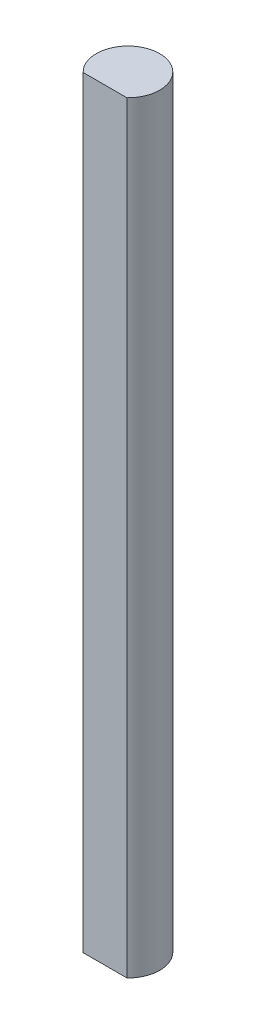
ISO-10303-21;
HEADER;
FILE_DESCRIPTION(('STEP AP214'),'2;1');
FILE_NAME('part.step','',(''),(''),'','','');
FILE_SCHEMA(('AUTOMOTIVE_DESIGN { 1 0 10303 214 1 1 1 1 }'));
ENDSEC;
DATA;
#1=APPLICATION_CONTEXT('core data for automotive mechanical design processes');
#2=APPLICATION_PROTOCOL_DEFINITION('international standard','automotive_design',2000,#1);
#3=PRODUCT_CONTEXT('',#1,'mechanical');
#4=PRODUCT('Part','Part','',(#3));
#5=PRODUCT_RELATED_PRODUCT_CATEGORY('part','',(#4));
#6=PRODUCT_DEFINITION_FORMATION('','',#4);
#7=PRODUCT_DEFINITION_CONTEXT('part definition',#1,'design');
#8=PRODUCT_DEFINITION('design','',#6,#7);
#9=PRODUCT_DEFINITION_SHAPE('','',#8);
#10=(LENGTH_UNIT() NAMED_UNIT(*) SI_UNIT(.MILLI.,.METRE.));
#11=(NAMED_UNIT(*) PLANE_ANGLE_UNIT() SI_UNIT($,.RADIAN.));
#12=(NAMED_UNIT(*) SI_UNIT($,.STERADIAN.) SOLID_ANGLE_UNIT());
#13=UNCERTAINTY_MEASURE_WITH_UNIT(LENGTH_MEASURE(1.E-05),#10,'distance_accuracy_value','');
#14=(GEOMETRIC_REPRESENTATION_CONTEXT(3) GLOBAL_UNCERTAINTY_ASSIGNED_CONTEXT((#13)) GLOBAL_UNIT_ASSIGNED_CONTEXT((#10,
#11,#12)) REPRESENTATION_CONTEXT('',''));
#15=CARTESIAN_POINT('',(0.,0.,0.));
#16=DIRECTION('',(0.,0.,1.));
#17=DIRECTION('',(1.,0.,0.));
#18=AXIS2_PLACEMENT_3D('',#15,#16,#17);
#19=CARTESIAN_POINT('',(-1.72249818577553,29.499998279746,1.805));
#20=DIRECTION('',(0.,0.,1.));
#21=DIRECTION('',(0.,-1.,0.));
#22=AXIS2_PLACEMENT_3D('',#19,#20,#21);
#23=PLANE('',#22);
#24=DIRECTION('',(-1.,0.,0.));
#25=VECTOR('',#24,1.);
#26=CARTESIAN_POINT('',(-0.86124909288777,-28.9999998129054,1.805));
#27=LINE('',#26,#25);
#28=CARTESIAN_POINT('',(1.72249818577552,-28.9999998129054,1.805));
#29=VERTEX_POINT('',#28);
#30=CARTESIAN_POINT('',(-1.72249818577554,-28.9999998129054,1.805));
#31=VERTEX_POINT('',#30);
#32=EDGE_CURVE('E51',#29,#31,#27,.T.);
#33=ORIENTED_EDGE('',*,*,#32,.F.);
#34=DIRECTION('',(0.,-1.,0.));
#35=VECTOR('',#34,1.);
#36=CARTESIAN_POINT('',(1.72249818577554,29.299998279746,1.805));
#37=LINE('',#36,#35);
#38=CARTESIAN_POINT('',(1.72249818577554,30.9999975644894,1.805));
#39=VERTEX_POINT('',#38);
#40=EDGE_CURVE('E20',#39,#29,#37,.T.);
#41=ORIENTED_EDGE('',*,*,#40,.F.);
#42=DIRECTION('',(-1.,0.,0.));
#43=VECTOR('',#42,1.);
#44=CARTESIAN_POINT('',(-0.86124909288776,30.9999975644894,1.805));
#45=LINE('',#44,#43);
#46=CARTESIAN_POINT('',(-1.72249818577552,30.9999975644894,1.805));
#47=VERTEX_POINT('',#46);
#48=EDGE_CURVE('E11',#39,#47,#45,.T.);
#49=ORIENTED_EDGE('',*,*,#48,.T.);
#50=DIRECTION('',(0.,-1.,0.));
#51=VECTOR('',#50,1.);
#52=CARTESIAN_POINT('',(-1.72249818577553,29.299998279746,1.805));
#53=LINE('',#52,#51);
#54=EDGE_CURVE('E49',#47,#31,#53,.T.);
#55=ORIENTED_EDGE('',*,*,#54,.T.);
#56=EDGE_LOOP('',(#33,#41,#49,#55));
#57=FACE_BOUND('',#56,.T.);
#58=ADVANCED_FACE('F17',(#57),#23,.T.);
#59=CARTESIAN_POINT('',(0.,30.9999975644894,0.));
#60=DIRECTION('',(0.,1.,0.));
#61=DIRECTION('',(1.,0.,0.));
#62=AXIS2_PLACEMENT_3D('',#59,#60,#61);
#63=PLANE('',#62);
#64=CARTESIAN_POINT('',(0.,30.9999975644894,0.));
#65=DIRECTION('',(0.,-1.,0.));
#66=DIRECTION('',(1.,0.,0.));
#67=AXIS2_PLACEMENT_3D('',#64,#65,#66);
#68=CIRCLE('',#67,2.495);
#69=EDGE_CURVE('E57',#47,#39,#68,.T.);
#70=ORIENTED_EDGE('',*,*,#69,.F.);
#71=ORIENTED_EDGE('',*,*,#48,.F.);
#72=EDGE_LOOP('',(#70,#71));
#73=FACE_BOUND('',#72,.T.);
#74=ADVANCED_FACE('F99',(#73),#63,.T.);
#75=CARTESIAN_POINT('',(0.,-20.5000004768372,0.));
#76=DIRECTION('',(0.,-1.,0.));
#77=DIRECTION('',(0.,0.,-1.));
#78=AXIS2_PLACEMENT_3D('',#75,#76,#77);
#79=CYLINDRICAL_SURFACE('',#78,2.495);
#80=CARTESIAN_POINT('',(0.,-28.9999998129054,0.));
#81=DIRECTION('',(0.,-1.,0.));
#82=DIRECTION('',(1.,0.,0.));
#83=AXIS2_PLACEMENT_3D('',#80,#81,#82);
#84=CIRCLE('',#83,2.495);
#85=EDGE_CURVE('E61',#31,#29,#84,.T.);
#86=ORIENTED_EDGE('',*,*,#85,.F.);
#87=ORIENTED_EDGE('',*,*,#54,.F.);
#88=ORIENTED_EDGE('',*,*,#69,.T.);
#89=ORIENTED_EDGE('',*,*,#40,.T.);
#90=EDGE_LOOP('',(#86,#87,#88,#89));
#91=FACE_BOUND('',#90,.T.);
#92=ADVANCED_FACE('F64',(#91),#79,.T.);
#93=CARTESIAN_POINT('',(0.,-28.9999998129054,0.));
#94=DIRECTION('',(0.,1.,0.));
#95=DIRECTION('',(1.,0.,0.));
#96=AXIS2_PLACEMENT_3D('',#93,#94,#95);
#97=PLANE('',#96);
#98=ORIENTED_EDGE('',*,*,#85,.T.);
#99=ORIENTED_EDGE('',*,*,#32,.T.);
#100=EDGE_LOOP('',(#98,#99));
#101=FACE_BOUND('',#100,.T.);
#102=ADVANCED_FACE('F60',(#101),#97,.F.);
#103=CLOSED_SHELL('',(#58,#74,#92,#102));
#104=MANIFOLD_SOLID_BREP('B1',#103);
#105=ADVANCED_BREP_SHAPE_REPRESENTATION('',(#18,#104),#14);
#106=SHAPE_DEFINITION_REPRESENTATION(#9,#105);
ENDSEC;
END-ISO-10303-21;
